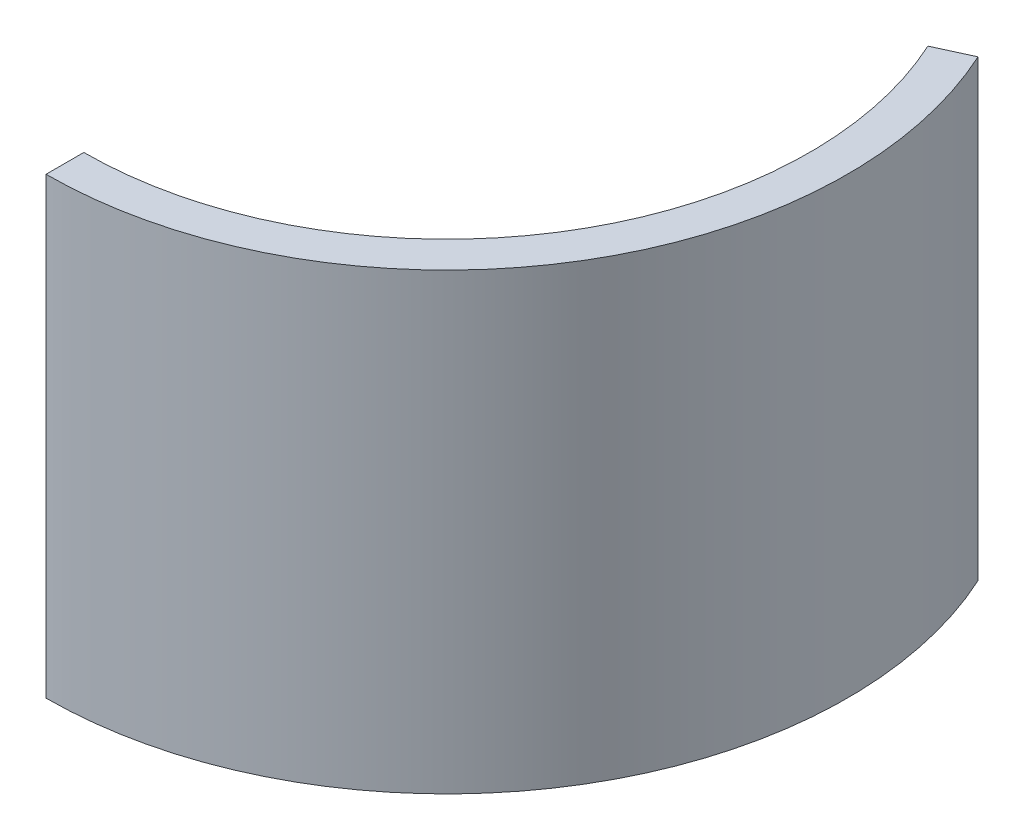
ISO-10303-21;
HEADER;
FILE_DESCRIPTION(('STEP AP214'),'2;1');
FILE_NAME('part.step','',(''),(''),'','','');
FILE_SCHEMA(('AUTOMOTIVE_DESIGN { 1 0 10303 214 1 1 1 1 }'));
ENDSEC;
DATA;
#1=APPLICATION_CONTEXT('core data for automotive mechanical design processes');
#2=APPLICATION_PROTOCOL_DEFINITION('international standard','automotive_design',2000,#1);
#3=PRODUCT_CONTEXT('',#1,'mechanical');
#4=PRODUCT('Part','Part','',(#3));
#5=PRODUCT_RELATED_PRODUCT_CATEGORY('part','',(#4));
#6=PRODUCT_DEFINITION_FORMATION('','',#4);
#7=PRODUCT_DEFINITION_CONTEXT('part definition',#1,'design');
#8=PRODUCT_DEFINITION('design','',#6,#7);
#9=PRODUCT_DEFINITION_SHAPE('','',#8);
#10=(LENGTH_UNIT() NAMED_UNIT(*) SI_UNIT(.MILLI.,.METRE.));
#11=(NAMED_UNIT(*) PLANE_ANGLE_UNIT() SI_UNIT($,.RADIAN.));
#12=(NAMED_UNIT(*) SI_UNIT($,.STERADIAN.) SOLID_ANGLE_UNIT());
#13=UNCERTAINTY_MEASURE_WITH_UNIT(LENGTH_MEASURE(1.E-05),#10,'distance_accuracy_value','');
#14=(GEOMETRIC_REPRESENTATION_CONTEXT(3) GLOBAL_UNCERTAINTY_ASSIGNED_CONTEXT((#13)) GLOBAL_UNIT_ASSIGNED_CONTEXT((#10,
#11,#12)) REPRESENTATION_CONTEXT('',''));
#15=CARTESIAN_POINT('',(0.,0.,0.));
#16=DIRECTION('',(0.,0.,1.));
#17=DIRECTION('',(1.,0.,0.));
#18=AXIS2_PLACEMENT_3D('',#15,#16,#17);
#19=CARTESIAN_POINT('',(0.,30.,0.));
#20=DIRECTION('',(1.,0.,0.));
#21=DIRECTION('',(0.,0.,-1.));
#22=AXIS2_PLACEMENT_3D('',#19,#20,#21);
#23=PLANE('',#22);
#24=DIRECTION('',(0.,0.,1.));
#25=VECTOR('',#24,1.);
#26=CARTESIAN_POINT('',(0.,0.,0.));
#27=LINE('',#26,#25);
#28=CARTESIAN_POINT('',(0.,0.,24.));
#29=VERTEX_POINT('',#28);
#30=CARTESIAN_POINT('',(0.,0.,26.5));
#31=VERTEX_POINT('',#30);
#32=EDGE_CURVE('E112',#29,#31,#27,.T.);
#33=ORIENTED_EDGE('',*,*,#32,.T.);
#34=DIRECTION('',(0.,-1.,0.));
#35=VECTOR('',#34,1.);
#36=CARTESIAN_POINT('',(0.,30.,26.5));
#37=LINE('',#36,#35);
#38=CARTESIAN_POINT('',(0.,30.,26.5));
#39=VERTEX_POINT('',#38);
#40=EDGE_CURVE('E11',#39,#31,#37,.T.);
#41=ORIENTED_EDGE('',*,*,#40,.F.);
#42=DIRECTION('',(0.,0.,1.));
#43=VECTOR('',#42,1.);
#44=CARTESIAN_POINT('',(0.,30.,0.));
#45=LINE('',#44,#43);
#46=CARTESIAN_POINT('',(0.,30.,24.));
#47=VERTEX_POINT('',#46);
#48=EDGE_CURVE('E93',#47,#39,#45,.T.);
#49=ORIENTED_EDGE('',*,*,#48,.F.);
#50=DIRECTION('',(0.,-1.,0.));
#51=VECTOR('',#50,1.);
#52=CARTESIAN_POINT('',(0.,30.,24.));
#53=LINE('',#52,#51);
#54=EDGE_CURVE('E108',#47,#29,#53,.T.);
#55=ORIENTED_EDGE('',*,*,#54,.T.);
#56=EDGE_LOOP('',(#33,#41,#49,#55));
#57=FACE_BOUND('',#56,.T.);
#58=ADVANCED_FACE('F45',(#57),#23,.F.);
#59=CARTESIAN_POINT('',(0.,30.,0.));
#60=DIRECTION('',(0.,-1.,0.));
#61=DIRECTION('',(0.,0.,-1.));
#62=AXIS2_PLACEMENT_3D('',#59,#60,#61);
#63=CYLINDRICAL_SURFACE('',#62,26.5);
#64=CARTESIAN_POINT('',(0.,0.,0.));
#65=DIRECTION('',(0.,1.,0.));
#66=DIRECTION('',(0.,0.,1.));
#67=AXIS2_PLACEMENT_3D('',#64,#65,#66);
#68=CIRCLE('',#67,26.5);
#69=CARTESIAN_POINT('',(24.0900725864872,0.,-11.0416666666667));
#70=VERTEX_POINT('',#69);
#71=EDGE_CURVE('E99',#31,#70,#68,.T.);
#72=ORIENTED_EDGE('',*,*,#71,.T.);
#73=DIRECTION('',(0.,-1.,0.));
#74=VECTOR('',#73,1.);
#75=CARTESIAN_POINT('',(24.0900725864872,30.,-11.0416666666667));
#76=LINE('',#75,#74);
#77=CARTESIAN_POINT('',(24.0900725864872,30.,-11.0416666666667));
#78=VERTEX_POINT('',#77);
#79=EDGE_CURVE('E54',#78,#70,#76,.T.);
#80=ORIENTED_EDGE('',*,*,#79,.F.);
#81=CARTESIAN_POINT('',(0.,30.,0.));
#82=DIRECTION('',(0.,1.,0.));
#83=DIRECTION('',(0.,0.,1.));
#84=AXIS2_PLACEMENT_3D('',#81,#82,#83);
#85=CIRCLE('',#84,26.5);
#86=EDGE_CURVE('E88',#39,#78,#85,.T.);
#87=ORIENTED_EDGE('',*,*,#86,.F.);
#88=ORIENTED_EDGE('',*,*,#40,.T.);
#89=EDGE_LOOP('',(#72,#80,#87,#88));
#90=FACE_BOUND('',#89,.T.);
#91=ADVANCED_FACE('F98',(#90),#63,.T.);
#92=CARTESIAN_POINT('',(0.,30.,0.));
#93=DIRECTION('',(-0.416666666666667,0.,-0.909059342886309));
#94=DIRECTION('',(-0.909059342886309,0.,0.416666666666667));
#95=AXIS2_PLACEMENT_3D('',#92,#93,#94);
#96=PLANE('',#95);
#97=DIRECTION('',(0.909059342886309,0.,-0.416666666666667));
#98=VECTOR('',#97,1.);
#99=CARTESIAN_POINT('',(0.,0.,0.));
#100=LINE('',#99,#98);
#101=CARTESIAN_POINT('',(21.8174242292714,0.,-10.));
#102=VERTEX_POINT('',#101);
#103=EDGE_CURVE('E118',#102,#70,#100,.T.);
#104=ORIENTED_EDGE('',*,*,#103,.F.);
#105=DIRECTION('',(0.,-1.,0.));
#106=VECTOR('',#105,1.);
#107=CARTESIAN_POINT('',(21.8174242292714,30.,-10.));
#108=LINE('',#107,#106);
#109=CARTESIAN_POINT('',(21.8174242292714,30.,-10.));
#110=VERTEX_POINT('',#109);
#111=EDGE_CURVE('E78',#110,#102,#108,.T.);
#112=ORIENTED_EDGE('',*,*,#111,.F.);
#113=DIRECTION('',(0.909059342886309,0.,-0.416666666666667));
#114=VECTOR('',#113,1.);
#115=CARTESIAN_POINT('',(0.,30.,0.));
#116=LINE('',#115,#114);
#117=EDGE_CURVE('E91',#110,#78,#116,.T.);
#118=ORIENTED_EDGE('',*,*,#117,.T.);
#119=ORIENTED_EDGE('',*,*,#79,.T.);
#120=EDGE_LOOP('',(#104,#112,#118,#119));
#121=FACE_BOUND('',#120,.T.);
#122=ADVANCED_FACE('F104',(#121),#96,.T.);
#123=CARTESIAN_POINT('',(0.,30.,0.));
#124=DIRECTION('',(0.,-1.,0.));
#125=DIRECTION('',(0.,0.,-1.));
#126=AXIS2_PLACEMENT_3D('',#123,#124,#125);
#127=CYLINDRICAL_SURFACE('',#126,24.);
#128=CARTESIAN_POINT('',(0.,0.,0.));
#129=DIRECTION('',(0.,1.,0.));
#130=DIRECTION('',(0.,0.,1.));
#131=AXIS2_PLACEMENT_3D('',#128,#129,#130);
#132=CIRCLE('',#131,24.);
#133=EDGE_CURVE('E81',#102,#29,#132,.F.);
#134=ORIENTED_EDGE('',*,*,#133,.T.);
#135=ORIENTED_EDGE('',*,*,#54,.F.);
#136=CARTESIAN_POINT('',(0.,30.,0.));
#137=DIRECTION('',(0.,1.,0.));
#138=DIRECTION('',(0.,0.,1.));
#139=AXIS2_PLACEMENT_3D('',#136,#137,#138);
#140=CIRCLE('',#139,24.);
#141=EDGE_CURVE('E62',#110,#47,#140,.F.);
#142=ORIENTED_EDGE('',*,*,#141,.F.);
#143=ORIENTED_EDGE('',*,*,#111,.T.);
#144=EDGE_LOOP('',(#134,#135,#142,#143));
#145=FACE_BOUND('',#144,.T.);
#146=ADVANCED_FACE('F135',(#145),#127,.F.);
#147=CARTESIAN_POINT('',(0.,30.,0.));
#148=DIRECTION('',(0.,1.,0.));
#149=DIRECTION('',(0.,0.,1.));
#150=AXIS2_PLACEMENT_3D('',#147,#148,#149);
#151=PLANE('',#150);
#152=ORIENTED_EDGE('',*,*,#48,.T.);
#153=ORIENTED_EDGE('',*,*,#86,.T.);
#154=ORIENTED_EDGE('',*,*,#117,.F.);
#155=ORIENTED_EDGE('',*,*,#141,.T.);
#156=EDGE_LOOP('',(#152,#153,#154,#155));
#157=FACE_BOUND('',#156,.T.);
#158=ADVANCED_FACE('F89',(#157),#151,.T.);
#159=CARTESIAN_POINT('',(0.,0.,0.));
#160=DIRECTION('',(0.,1.,0.));
#161=DIRECTION('',(0.,0.,1.));
#162=AXIS2_PLACEMENT_3D('',#159,#160,#161);
#163=PLANE('',#162);
#164=ORIENTED_EDGE('',*,*,#32,.F.);
#165=ORIENTED_EDGE('',*,*,#133,.F.);
#166=ORIENTED_EDGE('',*,*,#103,.T.);
#167=ORIENTED_EDGE('',*,*,#71,.F.);
#168=EDGE_LOOP('',(#164,#165,#166,#167));
#169=FACE_BOUND('',#168,.T.);
#170=ADVANCED_FACE('F129',(#169),#163,.F.);
#171=CLOSED_SHELL('',(#58,#91,#122,#146,#158,#170));
#172=MANIFOLD_SOLID_BREP('B2',#171);
#173=ADVANCED_BREP_SHAPE_REPRESENTATION('',(#18,#172),#14);
#174=SHAPE_DEFINITION_REPRESENTATION(#9,#173);
ENDSEC;
END-ISO-10303-21;
